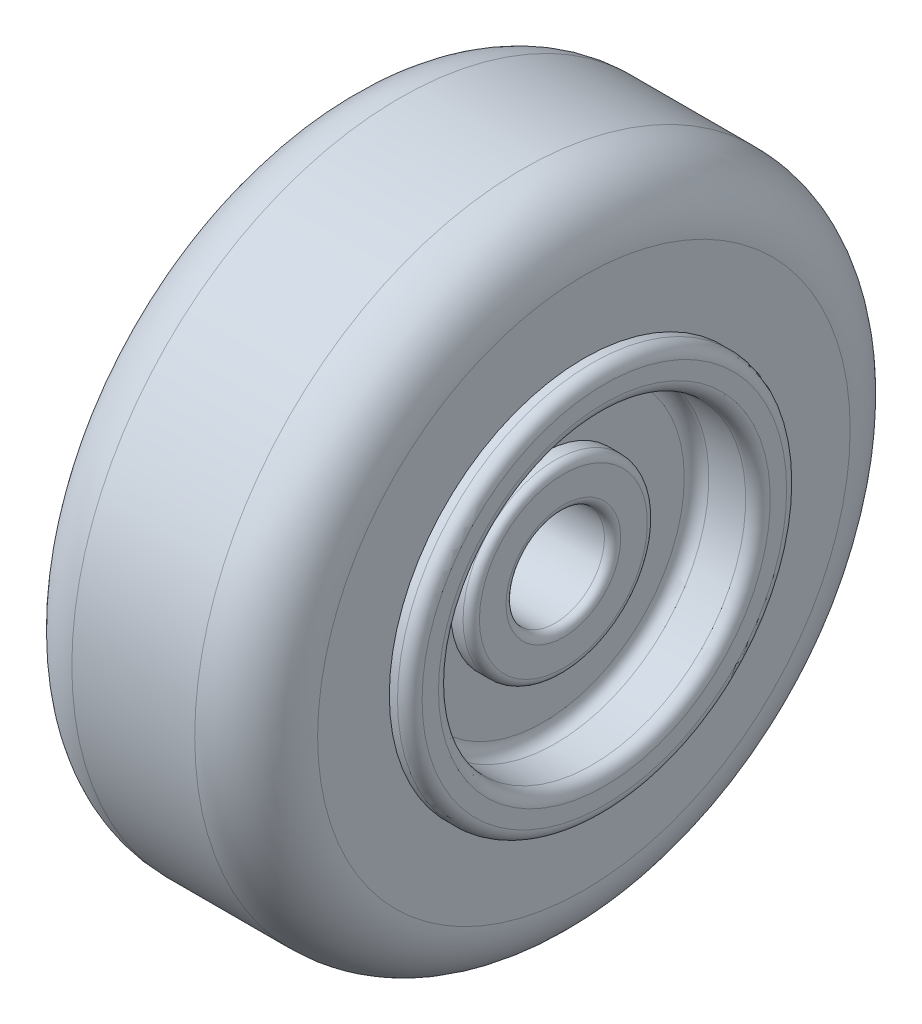
ISO-10303-21;
HEADER;
FILE_DESCRIPTION(('STEP AP214'),'2;1');
FILE_NAME('part.step','',(''),(''),'','','');
FILE_SCHEMA(('AUTOMOTIVE_DESIGN { 1 0 10303 214 1 1 1 1 }'));
ENDSEC;
DATA;
#1=APPLICATION_CONTEXT('core data for automotive mechanical design processes');
#2=APPLICATION_PROTOCOL_DEFINITION('international standard','automotive_design',2000,#1);
#3=PRODUCT_CONTEXT('',#1,'mechanical');
#4=PRODUCT('Part','Part','',(#3));
#5=PRODUCT_RELATED_PRODUCT_CATEGORY('part','',(#4));
#6=PRODUCT_DEFINITION_FORMATION('','',#4);
#7=PRODUCT_DEFINITION_CONTEXT('part definition',#1,'design');
#8=PRODUCT_DEFINITION('design','',#6,#7);
#9=PRODUCT_DEFINITION_SHAPE('','',#8);
#10=(LENGTH_UNIT() NAMED_UNIT(*) SI_UNIT(.MILLI.,.METRE.));
#11=(NAMED_UNIT(*) PLANE_ANGLE_UNIT() SI_UNIT($,.RADIAN.));
#12=(NAMED_UNIT(*) SI_UNIT($,.STERADIAN.) SOLID_ANGLE_UNIT());
#13=UNCERTAINTY_MEASURE_WITH_UNIT(LENGTH_MEASURE(1.E-05),#10,'distance_accuracy_value','');
#14=(GEOMETRIC_REPRESENTATION_CONTEXT(3) GLOBAL_UNCERTAINTY_ASSIGNED_CONTEXT((#13)) GLOBAL_UNIT_ASSIGNED_CONTEXT((#10,
#11,#12)) REPRESENTATION_CONTEXT('',''));
#15=CARTESIAN_POINT('',(0.,0.,0.));
#16=DIRECTION('',(0.,0.,1.));
#17=DIRECTION('',(1.,0.,0.));
#18=AXIS2_PLACEMENT_3D('',#15,#16,#17);
#19=CARTESIAN_POINT('',(1.5,0.,0.));
#20=DIRECTION('',(-1.,0.,0.));
#21=DIRECTION('',(0.,0.,1.));
#22=AXIS2_PLACEMENT_3D('',#19,#20,#21);
#23=TOROIDAL_SURFACE('',#22,6.5,1.5);
#24=CARTESIAN_POINT('',(1.5,0.,0.));
#25=DIRECTION('',(-1.,0.,0.));
#26=DIRECTION('',(0.,0.,1.));
#27=AXIS2_PLACEMENT_3D('',#24,#25,#26);
#28=CIRCLE('',#27,8.);
#29=CARTESIAN_POINT('',(1.5,0.,8.));
#30=VERTEX_POINT('',#29);
#31=EDGE_CURVE('E119',#30,#30,#28,.T.);
#32=ORIENTED_EDGE('',*,*,#31,.F.);
#33=EDGE_LOOP('',(#32));
#34=FACE_BOUND('',#33,.T.);
#35=CARTESIAN_POINT('',(3.,0.,0.));
#36=DIRECTION('',(-1.,0.,0.));
#37=DIRECTION('',(0.,0.,1.));
#38=AXIS2_PLACEMENT_3D('',#35,#36,#37);
#39=CIRCLE('',#38,6.5);
#40=CARTESIAN_POINT('',(3.,0.,6.5));
#41=VERTEX_POINT('',#40);
#42=EDGE_CURVE('E10',#41,#41,#39,.T.);
#43=ORIENTED_EDGE('',*,*,#42,.T.);
#44=EDGE_LOOP('',(#43));
#45=FACE_BOUND('',#44,.T.);
#46=ADVANCED_FACE('F31',(#34,#45),#23,.T.);
#47=CARTESIAN_POINT('',(3.,6.5,0.));
#48=DIRECTION('',(-1.,0.,0.));
#49=DIRECTION('',(0.,0.,1.));
#50=AXIS2_PLACEMENT_3D('',#47,#48,#49);
#51=PLANE('',#50);
#52=ORIENTED_EDGE('',*,*,#42,.F.);
#53=EDGE_LOOP('',(#52));
#54=FACE_BOUND('',#53,.T.);
#55=CARTESIAN_POINT('',(3.,0.,0.));
#56=DIRECTION('',(-1.,0.,0.));
#57=DIRECTION('',(0.,0.,1.));
#58=AXIS2_PLACEMENT_3D('',#55,#56,#57);
#59=CIRCLE('',#58,4.75);
#60=CARTESIAN_POINT('',(3.,0.,4.75));
#61=VERTEX_POINT('',#60);
#62=EDGE_CURVE('E37',#61,#61,#59,.T.);
#63=ORIENTED_EDGE('',*,*,#62,.T.);
#64=EDGE_LOOP('',(#63));
#65=FACE_BOUND('',#64,.T.);
#66=ADVANCED_FACE('F126',(#54,#65),#51,.F.);
#67=CARTESIAN_POINT('',(0.,0.,0.));
#68=DIRECTION('',(-1.,0.,0.));
#69=DIRECTION('',(0.,0.,1.));
#70=AXIS2_PLACEMENT_3D('',#67,#68,#69);
#71=CYLINDRICAL_SURFACE('',#70,4.75);
#72=ORIENTED_EDGE('',*,*,#62,.F.);
#73=EDGE_LOOP('',(#72));
#74=FACE_BOUND('',#73,.T.);
#75=CARTESIAN_POINT('',(3.2,0.,0.));
#76=DIRECTION('',(-1.,0.,0.));
#77=DIRECTION('',(0.,0.,1.));
#78=AXIS2_PLACEMENT_3D('',#75,#76,#77);
#79=CIRCLE('',#78,4.75);
#80=CARTESIAN_POINT('',(3.2,0.,4.75));
#81=VERTEX_POINT('',#80);
#82=EDGE_CURVE('E41',#81,#81,#79,.T.);
#83=ORIENTED_EDGE('',*,*,#82,.T.);
#84=EDGE_LOOP('',(#83));
#85=FACE_BOUND('',#84,.T.);
#86=ADVANCED_FACE('F130',(#74,#85),#71,.T.);
#87=CARTESIAN_POINT('',(3.2,0.,0.));
#88=DIRECTION('',(-1.,0.,0.));
#89=DIRECTION('',(0.,0.,1.));
#90=AXIS2_PLACEMENT_3D('',#87,#88,#89);
#91=TOROIDAL_SURFACE('',#90,4.45,0.3);
#92=ORIENTED_EDGE('',*,*,#82,.F.);
#93=EDGE_LOOP('',(#92));
#94=FACE_BOUND('',#93,.T.);
#95=CARTESIAN_POINT('',(3.5,0.,0.));
#96=DIRECTION('',(-1.,0.,0.));
#97=DIRECTION('',(0.,0.,1.));
#98=AXIS2_PLACEMENT_3D('',#95,#96,#97);
#99=CIRCLE('',#98,4.45);
#100=CARTESIAN_POINT('',(3.5,0.,4.45));
#101=VERTEX_POINT('',#100);
#102=EDGE_CURVE('E45',#101,#101,#99,.T.);
#103=ORIENTED_EDGE('',*,*,#102,.T.);
#104=EDGE_LOOP('',(#103));
#105=FACE_BOUND('',#104,.T.);
#106=ADVANCED_FACE('F135',(#94,#105),#91,.T.);
#107=CARTESIAN_POINT('',(3.5,4.45,0.));
#108=DIRECTION('',(-1.,0.,0.));
#109=DIRECTION('',(0.,0.,1.));
#110=AXIS2_PLACEMENT_3D('',#107,#108,#109);
#111=PLANE('',#110);
#112=ORIENTED_EDGE('',*,*,#102,.F.);
#113=EDGE_LOOP('',(#112));
#114=FACE_BOUND('',#113,.T.);
#115=CARTESIAN_POINT('',(3.5,0.,0.));
#116=DIRECTION('',(-1.,0.,0.));
#117=DIRECTION('',(0.,0.,1.));
#118=AXIS2_PLACEMENT_3D('',#115,#116,#117);
#119=CIRCLE('',#118,4.05);
#120=CARTESIAN_POINT('',(3.5,0.,4.05));
#121=VERTEX_POINT('',#120);
#122=EDGE_CURVE('E50',#121,#121,#119,.T.);
#123=ORIENTED_EDGE('',*,*,#122,.T.);
#124=EDGE_LOOP('',(#123));
#125=FACE_BOUND('',#124,.T.);
#126=ADVANCED_FACE('F141',(#114,#125),#111,.F.);
#127=CARTESIAN_POINT('',(3.2,0.,0.));
#128=DIRECTION('',(-1.,0.,0.));
#129=DIRECTION('',(0.,0.,1.));
#130=AXIS2_PLACEMENT_3D('',#127,#128,#129);
#131=TOROIDAL_SURFACE('',#130,4.05,0.3);
#132=ORIENTED_EDGE('',*,*,#122,.F.);
#133=EDGE_LOOP('',(#132));
#134=FACE_BOUND('',#133,.T.);
#135=CARTESIAN_POINT('',(3.2,0.,0.));
#136=DIRECTION('',(-1.,0.,0.));
#137=DIRECTION('',(0.,0.,1.));
#138=AXIS2_PLACEMENT_3D('',#135,#136,#137);
#139=CIRCLE('',#138,3.75);
#140=CARTESIAN_POINT('',(3.2,0.,3.75));
#141=VERTEX_POINT('',#140);
#142=EDGE_CURVE('E53',#141,#141,#139,.T.);
#143=ORIENTED_EDGE('',*,*,#142,.T.);
#144=EDGE_LOOP('',(#143));
#145=FACE_BOUND('',#144,.T.);
#146=ADVANCED_FACE('F145',(#134,#145),#131,.T.);
#147=CARTESIAN_POINT('',(0.,0.,0.));
#148=DIRECTION('',(-1.,0.,0.));
#149=DIRECTION('',(0.,0.,1.));
#150=AXIS2_PLACEMENT_3D('',#147,#148,#149);
#151=CYLINDRICAL_SURFACE('',#150,3.75);
#152=ORIENTED_EDGE('',*,*,#142,.F.);
#153=EDGE_LOOP('',(#152));
#154=FACE_BOUND('',#153,.T.);
#155=CARTESIAN_POINT('',(2.3,0.,0.));
#156=DIRECTION('',(-1.,0.,0.));
#157=DIRECTION('',(0.,0.,1.));
#158=AXIS2_PLACEMENT_3D('',#155,#156,#157);
#159=CIRCLE('',#158,3.75);
#160=CARTESIAN_POINT('',(2.3,0.,3.75));
#161=VERTEX_POINT('',#160);
#162=EDGE_CURVE('E56',#161,#161,#159,.T.);
#163=ORIENTED_EDGE('',*,*,#162,.T.);
#164=EDGE_LOOP('',(#163));
#165=FACE_BOUND('',#164,.T.);
#166=ADVANCED_FACE('F149',(#154,#165),#151,.F.);
#167=CARTESIAN_POINT('',(2.3,0.,0.));
#168=DIRECTION('',(-1.,0.,0.));
#169=DIRECTION('',(0.,0.,1.));
#170=AXIS2_PLACEMENT_3D('',#167,#168,#169);
#171=TOROIDAL_SURFACE('',#170,3.45,0.3);
#172=ORIENTED_EDGE('',*,*,#162,.F.);
#173=EDGE_LOOP('',(#172));
#174=FACE_BOUND('',#173,.T.);
#175=CARTESIAN_POINT('',(2.,0.,0.));
#176=DIRECTION('',(-1.,0.,0.));
#177=DIRECTION('',(0.,0.,1.));
#178=AXIS2_PLACEMENT_3D('',#175,#176,#177);
#179=CIRCLE('',#178,3.45);
#180=CARTESIAN_POINT('',(2.,0.,3.45));
#181=VERTEX_POINT('',#180);
#182=EDGE_CURVE('E59',#181,#181,#179,.T.);
#183=ORIENTED_EDGE('',*,*,#182,.T.);
#184=EDGE_LOOP('',(#183));
#185=FACE_BOUND('',#184,.T.);
#186=ADVANCED_FACE('F153',(#174,#185),#171,.F.);
#187=CARTESIAN_POINT('',(2.,3.45,0.));
#188=DIRECTION('',(-1.,0.,0.));
#189=DIRECTION('',(0.,0.,1.));
#190=AXIS2_PLACEMENT_3D('',#187,#188,#189);
#191=PLANE('',#190);
#192=ORIENTED_EDGE('',*,*,#182,.F.);
#193=EDGE_LOOP('',(#192));
#194=FACE_BOUND('',#193,.T.);
#195=CARTESIAN_POINT('',(2.,0.,0.));
#196=DIRECTION('',(-1.,0.,0.));
#197=DIRECTION('',(0.,0.,1.));
#198=AXIS2_PLACEMENT_3D('',#195,#196,#197);
#199=CIRCLE('',#198,2.25);
#200=CARTESIAN_POINT('',(2.,0.,2.25));
#201=VERTEX_POINT('',#200);
#202=EDGE_CURVE('E62',#201,#201,#199,.T.);
#203=ORIENTED_EDGE('',*,*,#202,.T.);
#204=EDGE_LOOP('',(#203));
#205=FACE_BOUND('',#204,.T.);
#206=ADVANCED_FACE('F157',(#194,#205),#191,.F.);
#207=CARTESIAN_POINT('',(0.,0.,0.));
#208=DIRECTION('',(-1.,0.,0.));
#209=DIRECTION('',(0.,0.,1.));
#210=AXIS2_PLACEMENT_3D('',#207,#208,#209);
#211=CYLINDRICAL_SURFACE('',#210,2.25);
#212=ORIENTED_EDGE('',*,*,#202,.F.);
#213=EDGE_LOOP('',(#212));
#214=FACE_BOUND('',#213,.T.);
#215=CARTESIAN_POINT('',(2.3,0.,0.));
#216=DIRECTION('',(-1.,0.,0.));
#217=DIRECTION('',(0.,0.,1.));
#218=AXIS2_PLACEMENT_3D('',#215,#216,#217);
#219=CIRCLE('',#218,2.25);
#220=CARTESIAN_POINT('',(2.3,0.,2.25));
#221=VERTEX_POINT('',#220);
#222=EDGE_CURVE('E65',#221,#221,#219,.T.);
#223=ORIENTED_EDGE('',*,*,#222,.T.);
#224=EDGE_LOOP('',(#223));
#225=FACE_BOUND('',#224,.T.);
#226=ADVANCED_FACE('F161',(#214,#225),#211,.T.);
#227=CARTESIAN_POINT('',(2.3,0.,0.));
#228=DIRECTION('',(-1.,0.,0.));
#229=DIRECTION('',(0.,0.,1.));
#230=AXIS2_PLACEMENT_3D('',#227,#228,#229);
#231=TOROIDAL_SURFACE('',#230,2.05,0.2);
#232=ORIENTED_EDGE('',*,*,#222,.F.);
#233=EDGE_LOOP('',(#232));
#234=FACE_BOUND('',#233,.T.);
#235=CARTESIAN_POINT('',(2.5,0.,0.));
#236=DIRECTION('',(-1.,0.,0.));
#237=DIRECTION('',(0.,0.,1.));
#238=AXIS2_PLACEMENT_3D('',#235,#236,#237);
#239=CIRCLE('',#238,2.05);
#240=CARTESIAN_POINT('',(2.5,0.,2.05));
#241=VERTEX_POINT('',#240);
#242=EDGE_CURVE('E68',#241,#241,#239,.T.);
#243=ORIENTED_EDGE('',*,*,#242,.T.);
#244=EDGE_LOOP('',(#243));
#245=FACE_BOUND('',#244,.T.);
#246=ADVANCED_FACE('F165',(#234,#245),#231,.T.);
#247=CARTESIAN_POINT('',(2.5,1.4,0.));
#248=DIRECTION('',(-1.,0.,0.));
#249=DIRECTION('',(0.,0.,1.));
#250=AXIS2_PLACEMENT_3D('',#247,#248,#249);
#251=PLANE('',#250);
#252=ORIENTED_EDGE('',*,*,#242,.F.);
#253=EDGE_LOOP('',(#252));
#254=FACE_BOUND('',#253,.T.);
#255=CARTESIAN_POINT('',(2.5,0.,0.));
#256=DIRECTION('',(-1.,0.,0.));
#257=DIRECTION('',(0.,0.,1.));
#258=AXIS2_PLACEMENT_3D('',#255,#256,#257);
#259=CIRCLE('',#258,1.4);
#260=CARTESIAN_POINT('',(2.5,0.,1.4));
#261=VERTEX_POINT('',#260);
#262=EDGE_CURVE('E71',#261,#261,#259,.T.);
#263=ORIENTED_EDGE('',*,*,#262,.T.);
#264=EDGE_LOOP('',(#263));
#265=FACE_BOUND('',#264,.T.);
#266=ADVANCED_FACE('F169',(#254,#265),#251,.F.);
#267=CARTESIAN_POINT('',(2.3,0.,0.));
#268=DIRECTION('',(-1.,0.,0.));
#269=DIRECTION('',(0.,0.,1.));
#270=AXIS2_PLACEMENT_3D('',#267,#268,#269);
#271=TOROIDAL_SURFACE('',#270,1.4,0.2);
#272=ORIENTED_EDGE('',*,*,#262,.F.);
#273=EDGE_LOOP('',(#272));
#274=FACE_BOUND('',#273,.T.);
#275=CARTESIAN_POINT('',(2.3,0.,0.));
#276=DIRECTION('',(-1.,0.,0.));
#277=DIRECTION('',(0.,0.,1.));
#278=AXIS2_PLACEMENT_3D('',#275,#276,#277);
#279=CIRCLE('',#278,1.2);
#280=CARTESIAN_POINT('',(2.3,0.,1.2));
#281=VERTEX_POINT('',#280);
#282=EDGE_CURVE('E74',#281,#281,#279,.T.);
#283=ORIENTED_EDGE('',*,*,#282,.T.);
#284=EDGE_LOOP('',(#283));
#285=FACE_BOUND('',#284,.T.);
#286=ADVANCED_FACE('F173',(#274,#285),#271,.T.);
#287=CARTESIAN_POINT('',(0.,0.,0.));
#288=DIRECTION('',(-1.,0.,0.));
#289=DIRECTION('',(0.,0.,1.));
#290=AXIS2_PLACEMENT_3D('',#287,#288,#289);
#291=CYLINDRICAL_SURFACE('',#290,1.2);
#292=ORIENTED_EDGE('',*,*,#282,.F.);
#293=EDGE_LOOP('',(#292));
#294=FACE_BOUND('',#293,.T.);
#295=CARTESIAN_POINT('',(-2.3,0.,0.));
#296=DIRECTION('',(-1.,0.,0.));
#297=DIRECTION('',(0.,0.,1.));
#298=AXIS2_PLACEMENT_3D('',#295,#296,#297);
#299=CIRCLE('',#298,1.2);
#300=CARTESIAN_POINT('',(-2.3,0.,1.2));
#301=VERTEX_POINT('',#300);
#302=EDGE_CURVE('E77',#301,#301,#299,.T.);
#303=ORIENTED_EDGE('',*,*,#302,.T.);
#304=EDGE_LOOP('',(#303));
#305=FACE_BOUND('',#304,.T.);
#306=ADVANCED_FACE('F177',(#294,#305),#291,.F.);
#307=CARTESIAN_POINT('',(-2.3,0.,0.));
#308=DIRECTION('',(-1.,0.,0.));
#309=DIRECTION('',(0.,0.,1.));
#310=AXIS2_PLACEMENT_3D('',#307,#308,#309);
#311=TOROIDAL_SURFACE('',#310,1.4,0.2);
#312=ORIENTED_EDGE('',*,*,#302,.F.);
#313=EDGE_LOOP('',(#312));
#314=FACE_BOUND('',#313,.T.);
#315=CARTESIAN_POINT('',(-2.5,0.,0.));
#316=DIRECTION('',(-1.,0.,0.));
#317=DIRECTION('',(0.,0.,1.));
#318=AXIS2_PLACEMENT_3D('',#315,#316,#317);
#319=CIRCLE('',#318,1.4);
#320=CARTESIAN_POINT('',(-2.5,0.,1.4));
#321=VERTEX_POINT('',#320);
#322=EDGE_CURVE('E80',#321,#321,#319,.T.);
#323=ORIENTED_EDGE('',*,*,#322,.T.);
#324=EDGE_LOOP('',(#323));
#325=FACE_BOUND('',#324,.T.);
#326=ADVANCED_FACE('F181',(#314,#325),#311,.T.);
#327=CARTESIAN_POINT('',(-2.5,1.4,0.));
#328=DIRECTION('',(1.,0.,0.));
#329=DIRECTION('',(0.,0.,-1.));
#330=AXIS2_PLACEMENT_3D('',#327,#328,#329);
#331=PLANE('',#330);
#332=ORIENTED_EDGE('',*,*,#322,.F.);
#333=EDGE_LOOP('',(#332));
#334=FACE_BOUND('',#333,.T.);
#335=CARTESIAN_POINT('',(-2.5,0.,0.));
#336=DIRECTION('',(-1.,0.,0.));
#337=DIRECTION('',(0.,0.,1.));
#338=AXIS2_PLACEMENT_3D('',#335,#336,#337);
#339=CIRCLE('',#338,2.05);
#340=CARTESIAN_POINT('',(-2.5,0.,2.05));
#341=VERTEX_POINT('',#340);
#342=EDGE_CURVE('E83',#341,#341,#339,.T.);
#343=ORIENTED_EDGE('',*,*,#342,.T.);
#344=EDGE_LOOP('',(#343));
#345=FACE_BOUND('',#344,.T.);
#346=ADVANCED_FACE('F185',(#334,#345),#331,.F.);
#347=CARTESIAN_POINT('',(-2.3,0.,0.));
#348=DIRECTION('',(-1.,0.,0.));
#349=DIRECTION('',(0.,0.,1.));
#350=AXIS2_PLACEMENT_3D('',#347,#348,#349);
#351=TOROIDAL_SURFACE('',#350,2.05,0.2);
#352=ORIENTED_EDGE('',*,*,#342,.F.);
#353=EDGE_LOOP('',(#352));
#354=FACE_BOUND('',#353,.T.);
#355=CARTESIAN_POINT('',(-2.3,0.,0.));
#356=DIRECTION('',(-1.,0.,0.));
#357=DIRECTION('',(0.,0.,1.));
#358=AXIS2_PLACEMENT_3D('',#355,#356,#357);
#359=CIRCLE('',#358,2.25);
#360=CARTESIAN_POINT('',(-2.3,0.,2.25));
#361=VERTEX_POINT('',#360);
#362=EDGE_CURVE('E86',#361,#361,#359,.T.);
#363=ORIENTED_EDGE('',*,*,#362,.T.);
#364=EDGE_LOOP('',(#363));
#365=FACE_BOUND('',#364,.T.);
#366=ADVANCED_FACE('F189',(#354,#365),#351,.T.);
#367=CARTESIAN_POINT('',(0.,0.,0.));
#368=DIRECTION('',(-1.,0.,0.));
#369=DIRECTION('',(0.,0.,1.));
#370=AXIS2_PLACEMENT_3D('',#367,#368,#369);
#371=CYLINDRICAL_SURFACE('',#370,2.25);
#372=ORIENTED_EDGE('',*,*,#362,.F.);
#373=EDGE_LOOP('',(#372));
#374=FACE_BOUND('',#373,.T.);
#375=CARTESIAN_POINT('',(-2.,0.,0.));
#376=DIRECTION('',(-1.,0.,0.));
#377=DIRECTION('',(0.,0.,1.));
#378=AXIS2_PLACEMENT_3D('',#375,#376,#377);
#379=CIRCLE('',#378,2.25);
#380=CARTESIAN_POINT('',(-2.,0.,2.25));
#381=VERTEX_POINT('',#380);
#382=EDGE_CURVE('E89',#381,#381,#379,.T.);
#383=ORIENTED_EDGE('',*,*,#382,.T.);
#384=EDGE_LOOP('',(#383));
#385=FACE_BOUND('',#384,.T.);
#386=ADVANCED_FACE('F193',(#374,#385),#371,.T.);
#387=CARTESIAN_POINT('',(-2.,3.45,0.));
#388=DIRECTION('',(1.,0.,0.));
#389=DIRECTION('',(0.,0.,-1.));
#390=AXIS2_PLACEMENT_3D('',#387,#388,#389);
#391=PLANE('',#390);
#392=ORIENTED_EDGE('',*,*,#382,.F.);
#393=EDGE_LOOP('',(#392));
#394=FACE_BOUND('',#393,.T.);
#395=CARTESIAN_POINT('',(-2.,0.,0.));
#396=DIRECTION('',(-1.,0.,0.));
#397=DIRECTION('',(0.,0.,1.));
#398=AXIS2_PLACEMENT_3D('',#395,#396,#397);
#399=CIRCLE('',#398,3.45);
#400=CARTESIAN_POINT('',(-2.,0.,3.45));
#401=VERTEX_POINT('',#400);
#402=EDGE_CURVE('E92',#401,#401,#399,.T.);
#403=ORIENTED_EDGE('',*,*,#402,.T.);
#404=EDGE_LOOP('',(#403));
#405=FACE_BOUND('',#404,.T.);
#406=ADVANCED_FACE('F197',(#394,#405),#391,.F.);
#407=CARTESIAN_POINT('',(-2.3,0.,0.));
#408=DIRECTION('',(-1.,0.,0.));
#409=DIRECTION('',(0.,0.,1.));
#410=AXIS2_PLACEMENT_3D('',#407,#408,#409);
#411=TOROIDAL_SURFACE('',#410,3.45,0.3);
#412=ORIENTED_EDGE('',*,*,#402,.F.);
#413=EDGE_LOOP('',(#412));
#414=FACE_BOUND('',#413,.T.);
#415=CARTESIAN_POINT('',(-2.3,0.,0.));
#416=DIRECTION('',(-1.,0.,0.));
#417=DIRECTION('',(0.,0.,1.));
#418=AXIS2_PLACEMENT_3D('',#415,#416,#417);
#419=CIRCLE('',#418,3.75);
#420=CARTESIAN_POINT('',(-2.3,0.,3.75));
#421=VERTEX_POINT('',#420);
#422=EDGE_CURVE('E95',#421,#421,#419,.T.);
#423=ORIENTED_EDGE('',*,*,#422,.T.);
#424=EDGE_LOOP('',(#423));
#425=FACE_BOUND('',#424,.T.);
#426=ADVANCED_FACE('F201',(#414,#425),#411,.F.);
#427=CARTESIAN_POINT('',(0.,0.,0.));
#428=DIRECTION('',(-1.,0.,0.));
#429=DIRECTION('',(0.,0.,1.));
#430=AXIS2_PLACEMENT_3D('',#427,#428,#429);
#431=CYLINDRICAL_SURFACE('',#430,3.75);
#432=ORIENTED_EDGE('',*,*,#422,.F.);
#433=EDGE_LOOP('',(#432));
#434=FACE_BOUND('',#433,.T.);
#435=CARTESIAN_POINT('',(-3.2,0.,0.));
#436=DIRECTION('',(-1.,0.,0.));
#437=DIRECTION('',(0.,0.,1.));
#438=AXIS2_PLACEMENT_3D('',#435,#436,#437);
#439=CIRCLE('',#438,3.75);
#440=CARTESIAN_POINT('',(-3.2,0.,3.75));
#441=VERTEX_POINT('',#440);
#442=EDGE_CURVE('E98',#441,#441,#439,.T.);
#443=ORIENTED_EDGE('',*,*,#442,.T.);
#444=EDGE_LOOP('',(#443));
#445=FACE_BOUND('',#444,.T.);
#446=ADVANCED_FACE('F205',(#434,#445),#431,.F.);
#447=CARTESIAN_POINT('',(-3.2,0.,0.));
#448=DIRECTION('',(-1.,0.,0.));
#449=DIRECTION('',(0.,0.,1.));
#450=AXIS2_PLACEMENT_3D('',#447,#448,#449);
#451=TOROIDAL_SURFACE('',#450,4.05,0.3);
#452=ORIENTED_EDGE('',*,*,#442,.F.);
#453=EDGE_LOOP('',(#452));
#454=FACE_BOUND('',#453,.T.);
#455=CARTESIAN_POINT('',(-3.5,0.,0.));
#456=DIRECTION('',(-1.,0.,0.));
#457=DIRECTION('',(0.,0.,1.));
#458=AXIS2_PLACEMENT_3D('',#455,#456,#457);
#459=CIRCLE('',#458,4.05);
#460=CARTESIAN_POINT('',(-3.5,0.,4.05));
#461=VERTEX_POINT('',#460);
#462=EDGE_CURVE('E101',#461,#461,#459,.T.);
#463=ORIENTED_EDGE('',*,*,#462,.T.);
#464=EDGE_LOOP('',(#463));
#465=FACE_BOUND('',#464,.T.);
#466=ADVANCED_FACE('F209',(#454,#465),#451,.T.);
#467=CARTESIAN_POINT('',(-3.5,4.45,0.));
#468=DIRECTION('',(1.,0.,0.));
#469=DIRECTION('',(0.,0.,-1.));
#470=AXIS2_PLACEMENT_3D('',#467,#468,#469);
#471=PLANE('',#470);
#472=ORIENTED_EDGE('',*,*,#462,.F.);
#473=EDGE_LOOP('',(#472));
#474=FACE_BOUND('',#473,.T.);
#475=CARTESIAN_POINT('',(-3.5,0.,0.));
#476=DIRECTION('',(-1.,0.,0.));
#477=DIRECTION('',(0.,0.,1.));
#478=AXIS2_PLACEMENT_3D('',#475,#476,#477);
#479=CIRCLE('',#478,4.45);
#480=CARTESIAN_POINT('',(-3.5,0.,4.45));
#481=VERTEX_POINT('',#480);
#482=EDGE_CURVE('E104',#481,#481,#479,.T.);
#483=ORIENTED_EDGE('',*,*,#482,.T.);
#484=EDGE_LOOP('',(#483));
#485=FACE_BOUND('',#484,.T.);
#486=ADVANCED_FACE('F213',(#474,#485),#471,.F.);
#487=CARTESIAN_POINT('',(-3.2,0.,0.));
#488=DIRECTION('',(-1.,0.,0.));
#489=DIRECTION('',(0.,0.,1.));
#490=AXIS2_PLACEMENT_3D('',#487,#488,#489);
#491=TOROIDAL_SURFACE('',#490,4.45,0.3);
#492=ORIENTED_EDGE('',*,*,#482,.F.);
#493=EDGE_LOOP('',(#492));
#494=FACE_BOUND('',#493,.T.);
#495=CARTESIAN_POINT('',(-3.2,0.,0.));
#496=DIRECTION('',(-1.,0.,0.));
#497=DIRECTION('',(0.,0.,1.));
#498=AXIS2_PLACEMENT_3D('',#495,#496,#497);
#499=CIRCLE('',#498,4.75);
#500=CARTESIAN_POINT('',(-3.2,0.,4.75));
#501=VERTEX_POINT('',#500);
#502=EDGE_CURVE('E107',#501,#501,#499,.T.);
#503=ORIENTED_EDGE('',*,*,#502,.T.);
#504=EDGE_LOOP('',(#503));
#505=FACE_BOUND('',#504,.T.);
#506=ADVANCED_FACE('F217',(#494,#505),#491,.T.);
#507=CARTESIAN_POINT('',(0.,0.,0.));
#508=DIRECTION('',(-1.,0.,0.));
#509=DIRECTION('',(0.,0.,1.));
#510=AXIS2_PLACEMENT_3D('',#507,#508,#509);
#511=CYLINDRICAL_SURFACE('',#510,4.75);
#512=ORIENTED_EDGE('',*,*,#502,.F.);
#513=EDGE_LOOP('',(#512));
#514=FACE_BOUND('',#513,.T.);
#515=CARTESIAN_POINT('',(-3.,0.,0.));
#516=DIRECTION('',(-1.,0.,0.));
#517=DIRECTION('',(0.,0.,1.));
#518=AXIS2_PLACEMENT_3D('',#515,#516,#517);
#519=CIRCLE('',#518,4.75);
#520=CARTESIAN_POINT('',(-3.,0.,4.75));
#521=VERTEX_POINT('',#520);
#522=EDGE_CURVE('E110',#521,#521,#519,.T.);
#523=ORIENTED_EDGE('',*,*,#522,.T.);
#524=EDGE_LOOP('',(#523));
#525=FACE_BOUND('',#524,.T.);
#526=ADVANCED_FACE('F221',(#514,#525),#511,.T.);
#527=CARTESIAN_POINT('',(-3.,6.5,0.));
#528=DIRECTION('',(1.,0.,0.));
#529=DIRECTION('',(0.,0.,-1.));
#530=AXIS2_PLACEMENT_3D('',#527,#528,#529);
#531=PLANE('',#530);
#532=ORIENTED_EDGE('',*,*,#522,.F.);
#533=EDGE_LOOP('',(#532));
#534=FACE_BOUND('',#533,.T.);
#535=CARTESIAN_POINT('',(-3.,0.,0.));
#536=DIRECTION('',(-1.,0.,0.));
#537=DIRECTION('',(0.,0.,1.));
#538=AXIS2_PLACEMENT_3D('',#535,#536,#537);
#539=CIRCLE('',#538,6.5);
#540=CARTESIAN_POINT('',(-3.,0.,6.5));
#541=VERTEX_POINT('',#540);
#542=EDGE_CURVE('E113',#541,#541,#539,.T.);
#543=ORIENTED_EDGE('',*,*,#542,.T.);
#544=EDGE_LOOP('',(#543));
#545=FACE_BOUND('',#544,.T.);
#546=ADVANCED_FACE('F225',(#534,#545),#531,.F.);
#547=CARTESIAN_POINT('',(-1.5,0.,0.));
#548=DIRECTION('',(-1.,0.,0.));
#549=DIRECTION('',(0.,0.,1.));
#550=AXIS2_PLACEMENT_3D('',#547,#548,#549);
#551=TOROIDAL_SURFACE('',#550,6.5,1.5);
#552=ORIENTED_EDGE('',*,*,#542,.F.);
#553=EDGE_LOOP('',(#552));
#554=FACE_BOUND('',#553,.T.);
#555=CARTESIAN_POINT('',(-1.5,0.,0.));
#556=DIRECTION('',(-1.,0.,0.));
#557=DIRECTION('',(0.,0.,1.));
#558=AXIS2_PLACEMENT_3D('',#555,#556,#557);
#559=CIRCLE('',#558,8.);
#560=CARTESIAN_POINT('',(-1.5,0.,8.));
#561=VERTEX_POINT('',#560);
#562=EDGE_CURVE('E116',#561,#561,#559,.T.);
#563=ORIENTED_EDGE('',*,*,#562,.T.);
#564=EDGE_LOOP('',(#563));
#565=FACE_BOUND('',#564,.T.);
#566=ADVANCED_FACE('F229',(#554,#565),#551,.T.);
#567=CARTESIAN_POINT('',(0.,0.,0.));
#568=DIRECTION('',(-1.,0.,0.));
#569=DIRECTION('',(0.,0.,1.));
#570=AXIS2_PLACEMENT_3D('',#567,#568,#569);
#571=CYLINDRICAL_SURFACE('',#570,8.);
#572=ORIENTED_EDGE('',*,*,#562,.F.);
#573=EDGE_LOOP('',(#572));
#574=FACE_BOUND('',#573,.T.);
#575=ORIENTED_EDGE('',*,*,#31,.T.);
#576=EDGE_LOOP('',(#575));
#577=FACE_BOUND('',#576,.T.);
#578=ADVANCED_FACE('F123',(#574,#577),#571,.T.);
#579=CLOSED_SHELL('',(#46,#66,#86,#106,#126,#146,#166,#186,#206,#226,#246,#266,#286,#306,#326,
#346,#366,#386,#406,#426,#446,#466,#486,#506,#526,#546,#566,#578));
#580=MANIFOLD_SOLID_BREP('B2',#579);
#581=ADVANCED_BREP_SHAPE_REPRESENTATION('',(#18,#580),#14);
#582=SHAPE_DEFINITION_REPRESENTATION(#9,#581);
ENDSEC;
END-ISO-10303-21;
